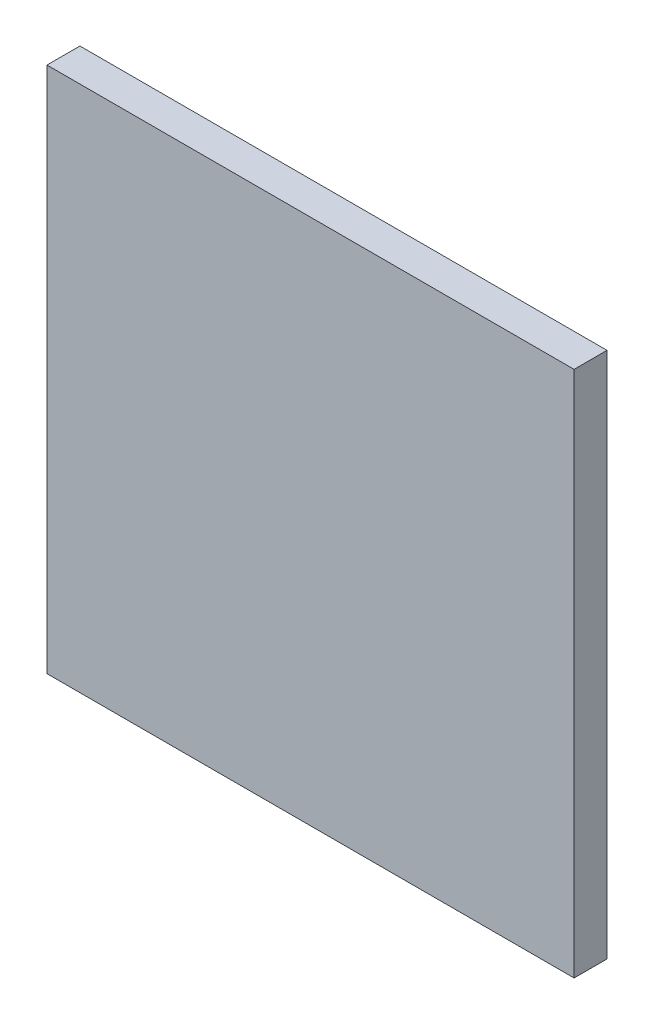
ISO-10303-21;
HEADER;
FILE_DESCRIPTION(('STEP AP214'),'2;1');
FILE_NAME('part.step','',(''),(''),'','','');
FILE_SCHEMA(('AUTOMOTIVE_DESIGN { 1 0 10303 214 1 1 1 1 }'));
ENDSEC;
DATA;
#1=APPLICATION_CONTEXT('core data for automotive mechanical design processes');
#2=APPLICATION_PROTOCOL_DEFINITION('international standard','automotive_design',2000,#1);
#3=PRODUCT_CONTEXT('',#1,'mechanical');
#4=PRODUCT('Part','Part','',(#3));
#5=PRODUCT_RELATED_PRODUCT_CATEGORY('part','',(#4));
#6=PRODUCT_DEFINITION_FORMATION('','',#4);
#7=PRODUCT_DEFINITION_CONTEXT('part definition',#1,'design');
#8=PRODUCT_DEFINITION('design','',#6,#7);
#9=PRODUCT_DEFINITION_SHAPE('','',#8);
#10=(LENGTH_UNIT() NAMED_UNIT(*) SI_UNIT(.MILLI.,.METRE.));
#11=(NAMED_UNIT(*) PLANE_ANGLE_UNIT() SI_UNIT($,.RADIAN.));
#12=(NAMED_UNIT(*) SI_UNIT($,.STERADIAN.) SOLID_ANGLE_UNIT());
#13=UNCERTAINTY_MEASURE_WITH_UNIT(LENGTH_MEASURE(1.E-05),#10,'distance_accuracy_value','');
#14=(GEOMETRIC_REPRESENTATION_CONTEXT(3) GLOBAL_UNCERTAINTY_ASSIGNED_CONTEXT((#13)) GLOBAL_UNIT_ASSIGNED_CONTEXT((#10,
#11,#12)) REPRESENTATION_CONTEXT('',''));
#15=CARTESIAN_POINT('',(0.,0.,0.));
#16=DIRECTION('',(0.,0.,1.));
#17=DIRECTION('',(1.,0.,0.));
#18=AXIS2_PLACEMENT_3D('',#15,#16,#17);
#19=CARTESIAN_POINT('',(-221.016904500549,159.6,25.));
#20=DIRECTION('',(1.,0.,0.));
#21=DIRECTION('',(0.,0.,-1.));
#22=AXIS2_PLACEMENT_3D('',#19,#20,#21);
#23=PLANE('',#22);
#24=DIRECTION('',(0.,0.,-1.));
#25=VECTOR('',#24,1.);
#26=CARTESIAN_POINT('',(-221.016904500549,159.6,25.));
#27=LINE('',#26,#25);
#28=CARTESIAN_POINT('',(-221.016904500549,159.6,25.));
#29=VERTEX_POINT('',#28);
#30=CARTESIAN_POINT('',(-221.016904500549,159.6,0.));
#31=VERTEX_POINT('',#30);
#32=EDGE_CURVE('E85',#29,#31,#27,.T.);
#33=ORIENTED_EDGE('',*,*,#32,.T.);
#34=DIRECTION('',(0.,-1.,0.));
#35=VECTOR('',#34,1.);
#36=CARTESIAN_POINT('',(-221.016904500549,159.6,0.));
#37=LINE('',#36,#35);
#38=CARTESIAN_POINT('',(-221.016904500549,-240.4,0.));
#39=VERTEX_POINT('',#38);
#40=EDGE_CURVE('E89',#31,#39,#37,.T.);
#41=ORIENTED_EDGE('',*,*,#40,.T.);
#42=DIRECTION('',(0.,0.,-1.));
#43=VECTOR('',#42,1.);
#44=CARTESIAN_POINT('',(-221.016904500549,-240.4,25.));
#45=LINE('',#44,#43);
#46=CARTESIAN_POINT('',(-221.016904500549,-240.4,25.));
#47=VERTEX_POINT('',#46);
#48=EDGE_CURVE('E11',#47,#39,#45,.T.);
#49=ORIENTED_EDGE('',*,*,#48,.F.);
#50=DIRECTION('',(0.,-1.,0.));
#51=VECTOR('',#50,1.);
#52=CARTESIAN_POINT('',(-221.016904500549,159.6,25.));
#53=LINE('',#52,#51);
#54=EDGE_CURVE('E75',#29,#47,#53,.T.);
#55=ORIENTED_EDGE('',*,*,#54,.F.);
#56=EDGE_LOOP('',(#33,#41,#49,#55));
#57=FACE_BOUND('',#56,.T.);
#58=ADVANCED_FACE('F33',(#57),#23,.F.);
#59=CARTESIAN_POINT('',(-221.016904500549,-240.4,25.));
#60=DIRECTION('',(0.,1.,0.));
#61=DIRECTION('',(0.,0.,1.));
#62=AXIS2_PLACEMENT_3D('',#59,#60,#61);
#63=PLANE('',#62);
#64=DIRECTION('',(1.,0.,0.));
#65=VECTOR('',#64,1.);
#66=CARTESIAN_POINT('',(-221.016904500549,-240.4,0.));
#67=LINE('',#66,#65);
#68=CARTESIAN_POINT('',(178.983095499451,-240.4,0.));
#69=VERTEX_POINT('',#68);
#70=EDGE_CURVE('E63',#39,#69,#67,.T.);
#71=ORIENTED_EDGE('',*,*,#70,.T.);
#72=DIRECTION('',(0.,0.,-1.));
#73=VECTOR('',#72,1.);
#74=CARTESIAN_POINT('',(178.983095499451,-240.4,25.));
#75=LINE('',#74,#73);
#76=CARTESIAN_POINT('',(178.983095499451,-240.4,25.));
#77=VERTEX_POINT('',#76);
#78=EDGE_CURVE('E41',#77,#69,#75,.T.);
#79=ORIENTED_EDGE('',*,*,#78,.F.);
#80=DIRECTION('',(1.,0.,0.));
#81=VECTOR('',#80,1.);
#82=CARTESIAN_POINT('',(-221.016904500549,-240.4,25.));
#83=LINE('',#82,#81);
#84=EDGE_CURVE('E104',#47,#77,#83,.T.);
#85=ORIENTED_EDGE('',*,*,#84,.F.);
#86=ORIENTED_EDGE('',*,*,#48,.T.);
#87=EDGE_LOOP('',(#71,#79,#85,#86));
#88=FACE_BOUND('',#87,.T.);
#89=ADVANCED_FACE('F107',(#88),#63,.F.);
#90=CARTESIAN_POINT('',(178.983095499451,159.6,25.));
#91=DIRECTION('',(-1.,0.,0.));
#92=DIRECTION('',(0.,-1.,0.));
#93=AXIS2_PLACEMENT_3D('',#90,#91,#92);
#94=PLANE('',#93);
#95=DIRECTION('',(0.,1.,0.));
#96=VECTOR('',#95,1.);
#97=CARTESIAN_POINT('',(178.983095499451,159.6,0.));
#98=LINE('',#97,#96);
#99=CARTESIAN_POINT('',(178.983095499451,159.6,0.));
#100=VERTEX_POINT('',#99);
#101=EDGE_CURVE('E70',#69,#100,#98,.T.);
#102=ORIENTED_EDGE('',*,*,#101,.T.);
#103=DIRECTION('',(0.,0.,-1.));
#104=VECTOR('',#103,1.);
#105=CARTESIAN_POINT('',(178.983095499451,159.6,25.));
#106=LINE('',#105,#104);
#107=CARTESIAN_POINT('',(178.983095499451,159.6,25.));
#108=VERTEX_POINT('',#107);
#109=EDGE_CURVE('E86',#108,#100,#106,.T.);
#110=ORIENTED_EDGE('',*,*,#109,.F.);
#111=DIRECTION('',(0.,1.,0.));
#112=VECTOR('',#111,1.);
#113=CARTESIAN_POINT('',(178.983095499451,159.6,25.));
#114=LINE('',#113,#112);
#115=EDGE_CURVE('E96',#77,#108,#114,.T.);
#116=ORIENTED_EDGE('',*,*,#115,.F.);
#117=ORIENTED_EDGE('',*,*,#78,.T.);
#118=EDGE_LOOP('',(#102,#110,#116,#117));
#119=FACE_BOUND('',#118,.T.);
#120=ADVANCED_FACE('F100',(#119),#94,.F.);
#121=CARTESIAN_POINT('',(-221.016904500549,159.6,25.));
#122=DIRECTION('',(0.,-1.,0.));
#123=DIRECTION('',(0.,0.,-1.));
#124=AXIS2_PLACEMENT_3D('',#121,#122,#123);
#125=PLANE('',#124);
#126=DIRECTION('',(-1.,0.,0.));
#127=VECTOR('',#126,1.);
#128=CARTESIAN_POINT('',(-221.016904500549,159.6,0.));
#129=LINE('',#128,#127);
#130=EDGE_CURVE('E81',#100,#31,#129,.T.);
#131=ORIENTED_EDGE('',*,*,#130,.T.);
#132=ORIENTED_EDGE('',*,*,#32,.F.);
#133=DIRECTION('',(-1.,0.,0.));
#134=VECTOR('',#133,1.);
#135=CARTESIAN_POINT('',(-221.016904500549,159.6,25.));
#136=LINE('',#135,#134);
#137=EDGE_CURVE('E49',#108,#29,#136,.T.);
#138=ORIENTED_EDGE('',*,*,#137,.F.);
#139=ORIENTED_EDGE('',*,*,#109,.T.);
#140=EDGE_LOOP('',(#131,#132,#138,#139));
#141=FACE_BOUND('',#140,.T.);
#142=ADVANCED_FACE('F83',(#141),#125,.F.);
#143=CARTESIAN_POINT('',(0.,0.,25.));
#144=DIRECTION('',(0.,0.,1.));
#145=DIRECTION('',(1.,0.,0.));
#146=AXIS2_PLACEMENT_3D('',#143,#144,#145);
#147=PLANE('',#146);
#148=ORIENTED_EDGE('',*,*,#115,.T.);
#149=ORIENTED_EDGE('',*,*,#137,.T.);
#150=ORIENTED_EDGE('',*,*,#54,.T.);
#151=ORIENTED_EDGE('',*,*,#84,.T.);
#152=EDGE_LOOP('',(#148,#149,#150,#151));
#153=FACE_BOUND('',#152,.T.);
#154=ADVANCED_FACE('F106',(#153),#147,.T.);
#155=CARTESIAN_POINT('',(0.,0.,0.));
#156=DIRECTION('',(0.,0.,1.));
#157=DIRECTION('',(1.,0.,0.));
#158=AXIS2_PLACEMENT_3D('',#155,#156,#157);
#159=PLANE('',#158);
#160=ORIENTED_EDGE('',*,*,#40,.F.);
#161=ORIENTED_EDGE('',*,*,#130,.F.);
#162=ORIENTED_EDGE('',*,*,#101,.F.);
#163=ORIENTED_EDGE('',*,*,#70,.F.);
#164=EDGE_LOOP('',(#160,#161,#162,#163));
#165=FACE_BOUND('',#164,.T.);
#166=ADVANCED_FACE('F90',(#165),#159,.F.);
#167=CLOSED_SHELL('',(#58,#89,#120,#142,#154,#166));
#168=MANIFOLD_SOLID_BREP('B2',#167);
#169=ADVANCED_BREP_SHAPE_REPRESENTATION('',(#18,#168),#14);
#170=SHAPE_DEFINITION_REPRESENTATION(#9,#169);
ENDSEC;
END-ISO-10303-21;
